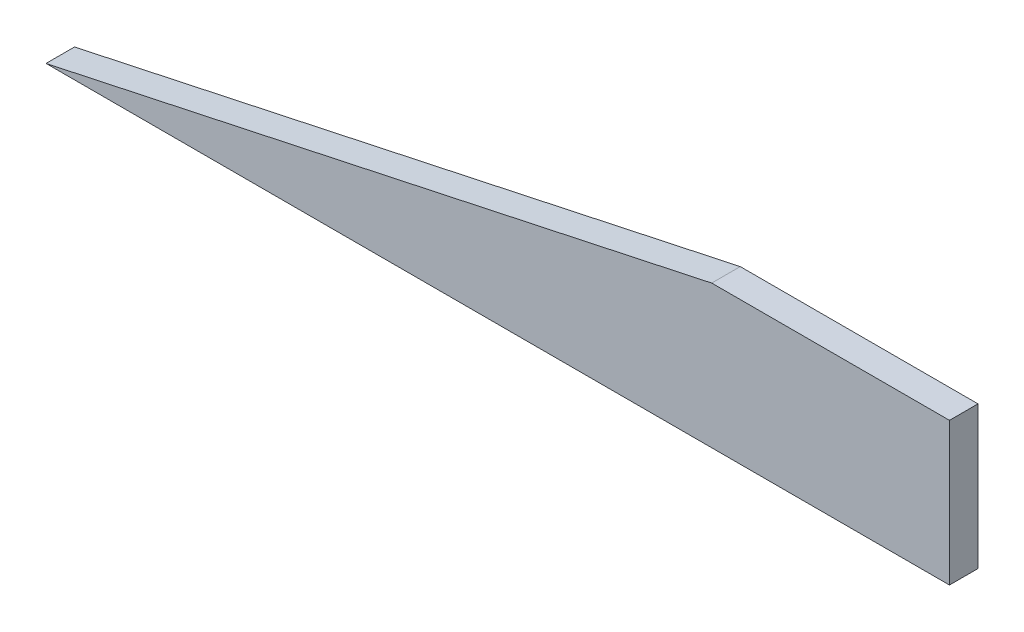
ISO-10303-21;
HEADER;
FILE_DESCRIPTION(('STEP AP214'),'2;1');
FILE_NAME('part.step','',(''),(''),'','','');
FILE_SCHEMA(('AUTOMOTIVE_DESIGN { 1 0 10303 214 1 1 1 1 }'));
ENDSEC;
DATA;
#1=APPLICATION_CONTEXT('core data for automotive mechanical design processes');
#2=APPLICATION_PROTOCOL_DEFINITION('international standard','automotive_design',2000,#1);
#3=PRODUCT_CONTEXT('',#1,'mechanical');
#4=PRODUCT('Part','Part','',(#3));
#5=PRODUCT_RELATED_PRODUCT_CATEGORY('part','',(#4));
#6=PRODUCT_DEFINITION_FORMATION('','',#4);
#7=PRODUCT_DEFINITION_CONTEXT('part definition',#1,'design');
#8=PRODUCT_DEFINITION('design','',#6,#7);
#9=PRODUCT_DEFINITION_SHAPE('','',#8);
#10=(LENGTH_UNIT() NAMED_UNIT(*) SI_UNIT(.MILLI.,.METRE.));
#11=(NAMED_UNIT(*) PLANE_ANGLE_UNIT() SI_UNIT($,.RADIAN.));
#12=(NAMED_UNIT(*) SI_UNIT($,.STERADIAN.) SOLID_ANGLE_UNIT());
#13=UNCERTAINTY_MEASURE_WITH_UNIT(LENGTH_MEASURE(1.E-05),#10,'distance_accuracy_value','');
#14=(GEOMETRIC_REPRESENTATION_CONTEXT(3) GLOBAL_UNCERTAINTY_ASSIGNED_CONTEXT((#13)) GLOBAL_UNIT_ASSIGNED_CONTEXT((#10,
#11,#12)) REPRESENTATION_CONTEXT('',''));
#15=CARTESIAN_POINT('',(0.,0.,0.));
#16=DIRECTION('',(0.,0.,1.));
#17=DIRECTION('',(1.,0.,0.));
#18=AXIS2_PLACEMENT_3D('',#15,#16,#17);
#19=CARTESIAN_POINT('',(-950.,0.,30.));
#20=DIRECTION('',(0.,1.,0.));
#21=DIRECTION('',(0.,0.,1.));
#22=AXIS2_PLACEMENT_3D('',#19,#20,#21);
#23=PLANE('',#22);
#24=DIRECTION('',(1.,0.,0.));
#25=VECTOR('',#24,1.);
#26=CARTESIAN_POINT('',(-950.,0.,0.));
#27=LINE('',#26,#25);
#28=CARTESIAN_POINT('',(-950.,0.,0.));
#29=VERTEX_POINT('',#28);
#30=CARTESIAN_POINT('',(0.,0.,0.));
#31=VERTEX_POINT('',#30);
#32=EDGE_CURVE('E96',#29,#31,#27,.T.);
#33=ORIENTED_EDGE('',*,*,#32,.T.);
#34=DIRECTION('',(0.,0.,-1.));
#35=VECTOR('',#34,1.);
#36=CARTESIAN_POINT('',(0.,0.,30.));
#37=LINE('',#36,#35);
#38=CARTESIAN_POINT('',(0.,0.,30.));
#39=VERTEX_POINT('',#38);
#40=EDGE_CURVE('E11',#39,#31,#37,.T.);
#41=ORIENTED_EDGE('',*,*,#40,.F.);
#42=DIRECTION('',(1.,0.,0.));
#43=VECTOR('',#42,1.);
#44=CARTESIAN_POINT('',(-950.,0.,30.));
#45=LINE('',#44,#43);
#46=CARTESIAN_POINT('',(-950.,0.,30.));
#47=VERTEX_POINT('',#46);
#48=EDGE_CURVE('E84',#47,#39,#45,.T.);
#49=ORIENTED_EDGE('',*,*,#48,.F.);
#50=DIRECTION('',(0.,0.,-1.));
#51=VECTOR('',#50,1.);
#52=CARTESIAN_POINT('',(-950.,0.,30.));
#53=LINE('',#52,#51);
#54=EDGE_CURVE('E92',#47,#29,#53,.T.);
#55=ORIENTED_EDGE('',*,*,#54,.T.);
#56=EDGE_LOOP('',(#33,#41,#49,#55));
#57=FACE_BOUND('',#56,.T.);
#58=ADVANCED_FACE('F33',(#57),#23,.F.);
#59=CARTESIAN_POINT('',(0.,0.,30.));
#60=DIRECTION('',(-1.,0.,0.));
#61=DIRECTION('',(0.,0.,1.));
#62=AXIS2_PLACEMENT_3D('',#59,#60,#61);
#63=PLANE('',#62);
#64=DIRECTION('',(0.,1.,0.));
#65=VECTOR('',#64,1.);
#66=CARTESIAN_POINT('',(0.,0.,0.));
#67=LINE('',#66,#65);
#68=CARTESIAN_POINT('',(0.,150.,0.));
#69=VERTEX_POINT('',#68);
#70=EDGE_CURVE('E88',#31,#69,#67,.T.);
#71=ORIENTED_EDGE('',*,*,#70,.T.);
#72=DIRECTION('',(0.,0.,-1.));
#73=VECTOR('',#72,1.);
#74=CARTESIAN_POINT('',(0.,150.,30.));
#75=LINE('',#74,#73);
#76=CARTESIAN_POINT('',(0.,150.,30.));
#77=VERTEX_POINT('',#76);
#78=EDGE_CURVE('E41',#77,#69,#75,.T.);
#79=ORIENTED_EDGE('',*,*,#78,.F.);
#80=DIRECTION('',(0.,1.,0.));
#81=VECTOR('',#80,1.);
#82=CARTESIAN_POINT('',(0.,0.,30.));
#83=LINE('',#82,#81);
#84=EDGE_CURVE('E79',#39,#77,#83,.T.);
#85=ORIENTED_EDGE('',*,*,#84,.F.);
#86=ORIENTED_EDGE('',*,*,#40,.T.);
#87=EDGE_LOOP('',(#71,#79,#85,#86));
#88=FACE_BOUND('',#87,.T.);
#89=ADVANCED_FACE('F87',(#88),#63,.F.);
#90=CARTESIAN_POINT('',(0.,150.,30.));
#91=DIRECTION('',(0.,-1.,0.));
#92=DIRECTION('',(0.,0.,-1.));
#93=AXIS2_PLACEMENT_3D('',#90,#91,#92);
#94=PLANE('',#93);
#95=DIRECTION('',(-1.,0.,0.));
#96=VECTOR('',#95,1.);
#97=CARTESIAN_POINT('',(0.,150.,0.));
#98=LINE('',#97,#96);
#99=CARTESIAN_POINT('',(-250.,150.,0.));
#100=VERTEX_POINT('',#99);
#101=EDGE_CURVE('E66',#69,#100,#98,.T.);
#102=ORIENTED_EDGE('',*,*,#101,.T.);
#103=DIRECTION('',(0.,0.,-1.));
#104=VECTOR('',#103,1.);
#105=CARTESIAN_POINT('',(-250.,150.,30.));
#106=LINE('',#105,#104);
#107=CARTESIAN_POINT('',(-250.,150.,30.));
#108=VERTEX_POINT('',#107);
#109=EDGE_CURVE('E89',#108,#100,#106,.T.);
#110=ORIENTED_EDGE('',*,*,#109,.F.);
#111=DIRECTION('',(-1.,0.,0.));
#112=VECTOR('',#111,1.);
#113=CARTESIAN_POINT('',(0.,150.,30.));
#114=LINE('',#113,#112);
#115=EDGE_CURVE('E82',#77,#108,#114,.T.);
#116=ORIENTED_EDGE('',*,*,#115,.F.);
#117=ORIENTED_EDGE('',*,*,#78,.T.);
#118=EDGE_LOOP('',(#102,#110,#116,#117));
#119=FACE_BOUND('',#118,.T.);
#120=ADVANCED_FACE('F90',(#119),#94,.F.);
#121=CARTESIAN_POINT('',(-250.,150.,30.));
#122=DIRECTION('',(0.209529088730873,-0.97780241407741,0.));
#123=DIRECTION('',(0.97780241407741,0.209529088730873,0.));
#124=AXIS2_PLACEMENT_3D('',#121,#122,#123);
#125=PLANE('',#124);
#126=DIRECTION('',(-0.97780241407741,-0.209529088730873,0.));
#127=VECTOR('',#126,1.);
#128=CARTESIAN_POINT('',(-250.,150.,0.));
#129=LINE('',#128,#127);
#130=EDGE_CURVE('E72',#100,#29,#129,.T.);
#131=ORIENTED_EDGE('',*,*,#130,.T.);
#132=ORIENTED_EDGE('',*,*,#54,.F.);
#133=DIRECTION('',(-0.97780241407741,-0.209529088730873,0.));
#134=VECTOR('',#133,1.);
#135=CARTESIAN_POINT('',(-250.,150.,30.));
#136=LINE('',#135,#134);
#137=EDGE_CURVE('E49',#108,#47,#136,.T.);
#138=ORIENTED_EDGE('',*,*,#137,.F.);
#139=ORIENTED_EDGE('',*,*,#109,.T.);
#140=EDGE_LOOP('',(#131,#132,#138,#139));
#141=FACE_BOUND('',#140,.T.);
#142=ADVANCED_FACE('F103',(#141),#125,.F.);
#143=CARTESIAN_POINT('',(0.,0.,30.));
#144=DIRECTION('',(0.,0.,1.));
#145=DIRECTION('',(1.,0.,0.));
#146=AXIS2_PLACEMENT_3D('',#143,#144,#145);
#147=PLANE('',#146);
#148=ORIENTED_EDGE('',*,*,#48,.T.);
#149=ORIENTED_EDGE('',*,*,#84,.T.);
#150=ORIENTED_EDGE('',*,*,#115,.T.);
#151=ORIENTED_EDGE('',*,*,#137,.T.);
#152=EDGE_LOOP('',(#148,#149,#150,#151));
#153=FACE_BOUND('',#152,.T.);
#154=ADVANCED_FACE('F80',(#153),#147,.T.);
#155=CARTESIAN_POINT('',(0.,0.,0.));
#156=DIRECTION('',(0.,0.,1.));
#157=DIRECTION('',(1.,0.,0.));
#158=AXIS2_PLACEMENT_3D('',#155,#156,#157);
#159=PLANE('',#158);
#160=ORIENTED_EDGE('',*,*,#32,.F.);
#161=ORIENTED_EDGE('',*,*,#130,.F.);
#162=ORIENTED_EDGE('',*,*,#101,.F.);
#163=ORIENTED_EDGE('',*,*,#70,.F.);
#164=EDGE_LOOP('',(#160,#161,#162,#163));
#165=FACE_BOUND('',#164,.T.);
#166=ADVANCED_FACE('F106',(#165),#159,.F.);
#167=CLOSED_SHELL('',(#58,#89,#120,#142,#154,#166));
#168=MANIFOLD_SOLID_BREP('B2',#167);
#169=ADVANCED_BREP_SHAPE_REPRESENTATION('',(#18,#168),#14);
#170=SHAPE_DEFINITION_REPRESENTATION(#9,#169);
ENDSEC;
END-ISO-10303-21;
